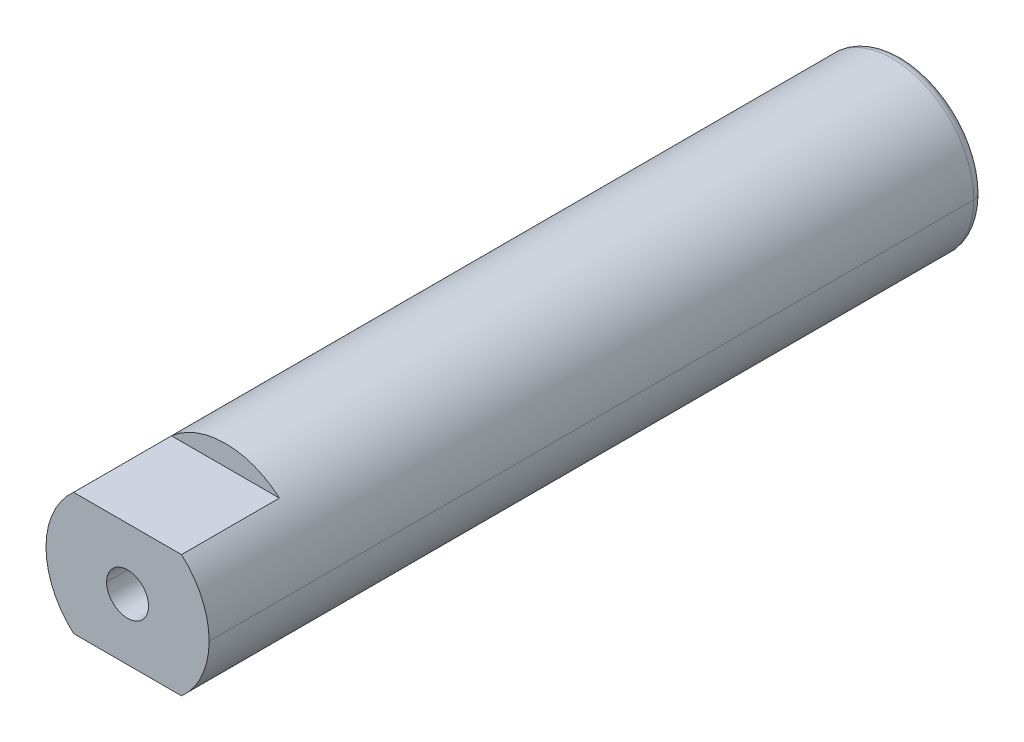
ISO-10303-21;
HEADER;
FILE_DESCRIPTION(('STEP AP214'),'2;1');
FILE_NAME('part.step','',(''),(''),'','','');
FILE_SCHEMA(('AUTOMOTIVE_DESIGN { 1 0 10303 214 1 1 1 1 }'));
ENDSEC;
DATA;
#1=APPLICATION_CONTEXT('core data for automotive mechanical design processes');
#2=APPLICATION_PROTOCOL_DEFINITION('international standard','automotive_design',2000,#1);
#3=PRODUCT_CONTEXT('',#1,'mechanical');
#4=PRODUCT('Part','Part','',(#3));
#5=PRODUCT_RELATED_PRODUCT_CATEGORY('part','',(#4));
#6=PRODUCT_DEFINITION_FORMATION('','',#4);
#7=PRODUCT_DEFINITION_CONTEXT('part definition',#1,'design');
#8=PRODUCT_DEFINITION('design','',#6,#7);
#9=PRODUCT_DEFINITION_SHAPE('','',#8);
#10=(LENGTH_UNIT() NAMED_UNIT(*) SI_UNIT(.MILLI.,.METRE.));
#11=(NAMED_UNIT(*) PLANE_ANGLE_UNIT() SI_UNIT($,.RADIAN.));
#12=(NAMED_UNIT(*) SI_UNIT($,.STERADIAN.) SOLID_ANGLE_UNIT());
#13=UNCERTAINTY_MEASURE_WITH_UNIT(LENGTH_MEASURE(1.E-05),#10,'distance_accuracy_value','');
#14=(GEOMETRIC_REPRESENTATION_CONTEXT(3) GLOBAL_UNCERTAINTY_ASSIGNED_CONTEXT((#13)) GLOBAL_UNIT_ASSIGNED_CONTEXT((#10,
#11,#12)) REPRESENTATION_CONTEXT('',''));
#15=CARTESIAN_POINT('',(0.,0.,0.));
#16=DIRECTION('',(0.,0.,1.));
#17=DIRECTION('',(1.,0.,0.));
#18=AXIS2_PLACEMENT_3D('',#15,#16,#17);
#19=CARTESIAN_POINT('',(-12.7,9.525,60.325));
#20=DIRECTION('',(0.,-1.,0.));
#21=DIRECTION('',(0.,0.,-1.));
#22=AXIS2_PLACEMENT_3D('',#19,#20,#21);
#23=PLANE('',#22);
#24=DIRECTION('',(1.,0.,0.));
#25=VECTOR('',#24,1.);
#26=CARTESIAN_POINT('',(0.,9.525,60.325));
#27=LINE('',#26,#25);
#28=CARTESIAN_POINT('',(-8.40026041263007,9.525,60.325));
#29=VERTEX_POINT('',#28);
#30=CARTESIAN_POINT('',(8.40026041263007,9.525,60.325));
#31=VERTEX_POINT('',#30);
#32=EDGE_CURVE('E168',#29,#31,#27,.T.);
#33=ORIENTED_EDGE('',*,*,#32,.T.);
#34=DIRECTION('',(0.,0.,1.));
#35=VECTOR('',#34,1.);
#36=CARTESIAN_POINT('',(8.40026041263007,9.525,60.325));
#37=LINE('',#36,#35);
#38=CARTESIAN_POINT('',(8.40026041263007,9.525,45.085));
#39=VERTEX_POINT('',#38);
#40=EDGE_CURVE('E163',#39,#31,#37,.T.);
#41=ORIENTED_EDGE('',*,*,#40,.F.);
#42=DIRECTION('',(1.,0.,0.));
#43=VECTOR('',#42,1.);
#44=CARTESIAN_POINT('',(-12.7,9.525,45.085));
#45=LINE('',#44,#43);
#46=CARTESIAN_POINT('',(-8.40026041263007,9.525,45.085));
#47=VERTEX_POINT('',#46);
#48=EDGE_CURVE('E11',#47,#39,#45,.T.);
#49=ORIENTED_EDGE('',*,*,#48,.F.);
#50=DIRECTION('',(0.,0.,-1.));
#51=VECTOR('',#50,1.);
#52=CARTESIAN_POINT('',(-8.40026041263007,9.525,60.325));
#53=LINE('',#52,#51);
#54=EDGE_CURVE('E181',#29,#47,#53,.T.);
#55=ORIENTED_EDGE('',*,*,#54,.F.);
#56=EDGE_LOOP('',(#33,#41,#49,#55));
#57=FACE_BOUND('',#56,.T.);
#58=ADVANCED_FACE('F17',(#57),#23,.F.);
#59=CARTESIAN_POINT('',(-12.7,12.7,45.085));
#60=DIRECTION('',(0.,0.,-1.));
#61=DIRECTION('',(0.,-1.,0.));
#62=AXIS2_PLACEMENT_3D('',#59,#60,#61);
#63=PLANE('',#62);
#64=ORIENTED_EDGE('',*,*,#48,.T.);
#65=CARTESIAN_POINT('',(0.,0.,45.085));
#66=DIRECTION('',(0.,0.,-1.));
#67=DIRECTION('',(-1.,0.,0.));
#68=AXIS2_PLACEMENT_3D('',#65,#66,#67);
#69=CIRCLE('',#68,12.7);
#70=EDGE_CURVE('E174',#47,#39,#69,.T.);
#71=ORIENTED_EDGE('',*,*,#70,.F.);
#72=EDGE_LOOP('',(#64,#71));
#73=FACE_BOUND('',#72,.T.);
#74=ADVANCED_FACE('F19',(#73),#63,.F.);
#75=CARTESIAN_POINT('',(-12.7,-9.525,60.325));
#76=DIRECTION('',(0.,1.,0.));
#77=DIRECTION('',(1.,0.,0.));
#78=AXIS2_PLACEMENT_3D('',#75,#76,#77);
#79=PLANE('',#78);
#80=DIRECTION('',(-1.,0.,0.));
#81=VECTOR('',#80,1.);
#82=CARTESIAN_POINT('',(0.,-9.525,60.325));
#83=LINE('',#82,#81);
#84=CARTESIAN_POINT('',(8.40026041263007,-9.525,60.325));
#85=VERTEX_POINT('',#84);
#86=CARTESIAN_POINT('',(-8.40026041263007,-9.525,60.325));
#87=VERTEX_POINT('',#86);
#88=EDGE_CURVE('E43',#85,#87,#83,.T.);
#89=ORIENTED_EDGE('',*,*,#88,.T.);
#90=DIRECTION('',(0.,0.,1.));
#91=VECTOR('',#90,1.);
#92=CARTESIAN_POINT('',(-8.40026041263007,-9.525,60.325));
#93=LINE('',#92,#91);
#94=CARTESIAN_POINT('',(-8.40026041263007,-9.525,45.085));
#95=VERTEX_POINT('',#94);
#96=EDGE_CURVE('E145',#95,#87,#93,.T.);
#97=ORIENTED_EDGE('',*,*,#96,.F.);
#98=DIRECTION('',(1.,0.,0.));
#99=VECTOR('',#98,1.);
#100=CARTESIAN_POINT('',(-12.7,-9.525,45.085));
#101=LINE('',#100,#99);
#102=CARTESIAN_POINT('',(8.40026041263007,-9.525,45.085));
#103=VERTEX_POINT('',#102);
#104=EDGE_CURVE('E28',#95,#103,#101,.T.);
#105=ORIENTED_EDGE('',*,*,#104,.T.);
#106=DIRECTION('',(0.,0.,-1.));
#107=VECTOR('',#106,1.);
#108=CARTESIAN_POINT('',(8.40026041263007,-9.525,60.325));
#109=LINE('',#108,#107);
#110=EDGE_CURVE('E146',#85,#103,#109,.T.);
#111=ORIENTED_EDGE('',*,*,#110,.F.);
#112=EDGE_LOOP('',(#89,#97,#105,#111));
#113=FACE_BOUND('',#112,.T.);
#114=ADVANCED_FACE('F264',(#113),#79,.F.);
#115=CARTESIAN_POINT('',(-12.7,-12.7,45.085));
#116=DIRECTION('',(0.,0.,-1.));
#117=DIRECTION('',(-1.,0.,0.));
#118=AXIS2_PLACEMENT_3D('',#115,#116,#117);
#119=PLANE('',#118);
#120=ORIENTED_EDGE('',*,*,#104,.F.);
#121=CARTESIAN_POINT('',(0.,0.,45.085));
#122=DIRECTION('',(0.,0.,-1.));
#123=DIRECTION('',(0.,1.,0.));
#124=AXIS2_PLACEMENT_3D('',#121,#122,#123);
#125=CIRCLE('',#124,12.7);
#126=EDGE_CURVE('E142',#103,#95,#125,.T.);
#127=ORIENTED_EDGE('',*,*,#126,.F.);
#128=EDGE_LOOP('',(#120,#127));
#129=FACE_BOUND('',#128,.T.);
#130=ADVANCED_FACE('F279',(#129),#119,.F.);
#131=CARTESIAN_POINT('',(0.,0.,60.325));
#132=DIRECTION('',(0.,0.,1.));
#133=DIRECTION('',(1.,0.,0.));
#134=AXIS2_PLACEMENT_3D('',#131,#132,#133);
#135=CYLINDRICAL_SURFACE('',#134,3.2639);
#136=DIRECTION('',(0.,0.,1.));
#137=VECTOR('',#136,1.);
#138=CARTESIAN_POINT('',(-3.2639,0.,60.325));
#139=LINE('',#138,#137);
#140=CARTESIAN_POINT('',(-3.2639,0.,31.115));
#141=VERTEX_POINT('',#140);
#142=CARTESIAN_POINT('',(-3.2639,0.,60.325));
#143=VERTEX_POINT('',#142);
#144=EDGE_CURVE('E175',#141,#143,#139,.T.);
#145=ORIENTED_EDGE('',*,*,#144,.F.);
#146=CARTESIAN_POINT('',(0.,0.,31.115));
#147=DIRECTION('',(0.,0.,1.));
#148=DIRECTION('',(1.,0.,0.));
#149=AXIS2_PLACEMENT_3D('',#146,#147,#148);
#150=CIRCLE('',#149,3.2639);
#151=CARTESIAN_POINT('',(3.2639,0.,31.115));
#152=VERTEX_POINT('',#151);
#153=EDGE_CURVE('E112',#152,#141,#150,.T.);
#154=ORIENTED_EDGE('',*,*,#153,.F.);
#155=DIRECTION('',(0.,0.,1.));
#156=VECTOR('',#155,1.);
#157=CARTESIAN_POINT('',(3.2639,0.,60.325));
#158=LINE('',#157,#156);
#159=CARTESIAN_POINT('',(3.2639,0.,60.325));
#160=VERTEX_POINT('',#159);
#161=EDGE_CURVE('E191',#152,#160,#158,.T.);
#162=ORIENTED_EDGE('',*,*,#161,.T.);
#163=CARTESIAN_POINT('',(0.,0.,60.325));
#164=DIRECTION('',(0.,0.,1.));
#165=DIRECTION('',(1.,0.,0.));
#166=AXIS2_PLACEMENT_3D('',#163,#164,#165);
#167=CIRCLE('',#166,3.2639);
#168=EDGE_CURVE('E113',#160,#143,#167,.T.);
#169=ORIENTED_EDGE('',*,*,#168,.T.);
#170=EDGE_LOOP('',(#145,#154,#162,#169));
#171=FACE_BOUND('',#170,.T.);
#172=ADVANCED_FACE('F226',(#171),#135,.F.);
#173=CARTESIAN_POINT('',(0.,0.,31.115));
#174=DIRECTION('',(0.,0.,1.));
#175=DIRECTION('',(1.,0.,0.));
#176=AXIS2_PLACEMENT_3D('',#173,#174,#175);
#177=CONICAL_SURFACE('',#176,3.2639,1.02974425867665);
#178=DIRECTION('',(-0.857167300702111,0.,0.515038074910056));
#179=VECTOR('',#178,1.);
#180=CARTESIAN_POINT('',(-3.2639,0.,31.115));
#181=LINE('',#180,#179);
#182=CARTESIAN_POINT('',(0.,0.,29.153851025556));
#183=VERTEX_POINT('',#182);
#184=EDGE_CURVE('E129',#183,#141,#181,.T.);
#185=ORIENTED_EDGE('',*,*,#184,.F.);
#186=DIRECTION('',(0.857167300702111,0.,0.515038074910056));
#187=VECTOR('',#186,1.);
#188=CARTESIAN_POINT('',(3.2639,0.,31.115));
#189=LINE('',#188,#187);
#190=EDGE_CURVE('E136',#183,#152,#189,.T.);
#191=ORIENTED_EDGE('',*,*,#190,.T.);
#192=ORIENTED_EDGE('',*,*,#153,.T.);
#193=EDGE_LOOP('',(#185,#191,#192));
#194=FACE_BOUND('',#193,.T.);
#195=ADVANCED_FACE('F278',(#194),#177,.F.);
#196=CARTESIAN_POINT('',(0.,0.,-58.7375));
#197=DIRECTION('',(0.,0.,1.));
#198=DIRECTION('',(1.,0.,0.));
#199=AXIS2_PLACEMENT_3D('',#196,#197,#198);
#200=TOROIDAL_SURFACE('',#199,11.1125,1.5875);
#201=CARTESIAN_POINT('',(-11.1125,0.,-58.7375));
#202=DIRECTION('',(0.,1.,0.));
#203=DIRECTION('',(-1.,0.,0.));
#204=AXIS2_PLACEMENT_3D('',#201,#202,#203);
#205=CIRCLE('',#204,1.5875);
#206=CARTESIAN_POINT('',(-11.1125,0.,-60.325));
#207=VERTEX_POINT('',#206);
#208=CARTESIAN_POINT('',(-12.7,0.,-58.7375));
#209=VERTEX_POINT('',#208);
#210=EDGE_CURVE('E116',#207,#209,#205,.T.);
#211=ORIENTED_EDGE('',*,*,#210,.F.);
#212=CARTESIAN_POINT('',(0.,0.,-60.325));
#213=DIRECTION('',(0.,0.,-1.));
#214=DIRECTION('',(1.,0.,0.));
#215=AXIS2_PLACEMENT_3D('',#212,#213,#214);
#216=CIRCLE('',#215,11.1125);
#217=CARTESIAN_POINT('',(11.1125,0.,-60.325));
#218=VERTEX_POINT('',#217);
#219=EDGE_CURVE('E103',#218,#207,#216,.T.);
#220=ORIENTED_EDGE('',*,*,#219,.F.);
#221=CARTESIAN_POINT('',(11.1125,0.,-58.7375));
#222=DIRECTION('',(0.,-1.,0.));
#223=DIRECTION('',(0.,0.,-1.));
#224=AXIS2_PLACEMENT_3D('',#221,#222,#223);
#225=CIRCLE('',#224,1.5875);
#226=CARTESIAN_POINT('',(12.7,0.,-58.7375));
#227=VERTEX_POINT('',#226);
#228=EDGE_CURVE('E127',#218,#227,#225,.T.);
#229=ORIENTED_EDGE('',*,*,#228,.T.);
#230=CARTESIAN_POINT('',(0.,0.,-58.7375));
#231=DIRECTION('',(0.,0.,1.));
#232=DIRECTION('',(1.,0.,0.));
#233=AXIS2_PLACEMENT_3D('',#230,#231,#232);
#234=CIRCLE('',#233,12.7);
#235=EDGE_CURVE('E119',#209,#227,#234,.T.);
#236=ORIENTED_EDGE('',*,*,#235,.F.);
#237=EDGE_LOOP('',(#211,#220,#229,#236));
#238=FACE_BOUND('',#237,.T.);
#239=ADVANCED_FACE('F117',(#238),#200,.T.);
#240=CARTESIAN_POINT('',(0.,0.,-60.325));
#241=DIRECTION('',(0.,0.,1.));
#242=DIRECTION('',(1.,0.,0.));
#243=AXIS2_PLACEMENT_3D('',#240,#241,#242);
#244=PLANE('',#243);
#245=ORIENTED_EDGE('',*,*,#219,.T.);
#246=CARTESIAN_POINT('',(0.,0.,-60.325));
#247=DIRECTION('',(0.,0.,-1.));
#248=DIRECTION('',(1.,0.,0.));
#249=AXIS2_PLACEMENT_3D('',#246,#247,#248);
#250=CIRCLE('',#249,11.1125);
#251=EDGE_CURVE('E107',#207,#218,#250,.T.);
#252=ORIENTED_EDGE('',*,*,#251,.T.);
#253=EDGE_LOOP('',(#245,#252));
#254=FACE_BOUND('',#253,.T.);
#255=ADVANCED_FACE('F105',(#254),#244,.F.);
#256=CARTESIAN_POINT('',(0.,0.,60.325));
#257=DIRECTION('',(0.,0.,1.));
#258=DIRECTION('',(1.,0.,0.));
#259=AXIS2_PLACEMENT_3D('',#256,#257,#258);
#260=PLANE('',#259);
#261=ORIENTED_EDGE('',*,*,#168,.F.);
#262=CARTESIAN_POINT('',(0.,0.,60.325));
#263=DIRECTION('',(0.,0.,1.));
#264=DIRECTION('',(1.,0.,0.));
#265=AXIS2_PLACEMENT_3D('',#262,#263,#264);
#266=CIRCLE('',#265,3.2639);
#267=EDGE_CURVE('E179',#143,#160,#266,.T.);
#268=ORIENTED_EDGE('',*,*,#267,.F.);
#269=EDGE_LOOP('',(#261,#268));
#270=FACE_BOUND('',#269,.T.);
#271=ORIENTED_EDGE('',*,*,#32,.F.);
#272=CARTESIAN_POINT('',(0.,0.,60.325));
#273=DIRECTION('',(0.,0.,1.));
#274=DIRECTION('',(1.,0.,0.));
#275=AXIS2_PLACEMENT_3D('',#272,#273,#274);
#276=CIRCLE('',#275,12.7);
#277=CARTESIAN_POINT('',(-12.7,0.,60.325));
#278=VERTEX_POINT('',#277);
#279=EDGE_CURVE('E185',#29,#278,#276,.T.);
#280=ORIENTED_EDGE('',*,*,#279,.T.);
#281=CARTESIAN_POINT('',(0.,0.,60.325));
#282=DIRECTION('',(0.,0.,1.));
#283=DIRECTION('',(1.,0.,0.));
#284=AXIS2_PLACEMENT_3D('',#281,#282,#283);
#285=CIRCLE('',#284,12.7);
#286=EDGE_CURVE('E155',#278,#87,#285,.T.);
#287=ORIENTED_EDGE('',*,*,#286,.T.);
#288=ORIENTED_EDGE('',*,*,#88,.F.);
#289=CARTESIAN_POINT('',(0.,0.,60.325));
#290=DIRECTION('',(0.,0.,1.));
#291=DIRECTION('',(1.,0.,0.));
#292=AXIS2_PLACEMENT_3D('',#289,#290,#291);
#293=CIRCLE('',#292,12.7);
#294=CARTESIAN_POINT('',(12.7,0.,60.325));
#295=VERTEX_POINT('',#294);
#296=EDGE_CURVE('E157',#85,#295,#293,.T.);
#297=ORIENTED_EDGE('',*,*,#296,.T.);
#298=CARTESIAN_POINT('',(0.,0.,60.325));
#299=DIRECTION('',(0.,0.,1.));
#300=DIRECTION('',(1.,0.,0.));
#301=AXIS2_PLACEMENT_3D('',#298,#299,#300);
#302=CIRCLE('',#301,12.7);
#303=EDGE_CURVE('E21',#295,#31,#302,.T.);
#304=ORIENTED_EDGE('',*,*,#303,.T.);
#305=EDGE_LOOP('',(#271,#280,#287,#288,#297,#304));
#306=FACE_BOUND('',#305,.T.);
#307=ADVANCED_FACE('F232',(#270,#306),#260,.T.);
#308=CARTESIAN_POINT('',(0.,0.,60.325));
#309=DIRECTION('',(0.,0.,-1.));
#310=DIRECTION('',(-1.,0.,0.));
#311=AXIS2_PLACEMENT_3D('',#308,#309,#310);
#312=CYLINDRICAL_SURFACE('',#311,12.7);
#313=DIRECTION('',(0.,0.,-1.));
#314=VECTOR('',#313,1.);
#315=CARTESIAN_POINT('',(12.7,0.,60.325));
#316=LINE('',#315,#314);
#317=EDGE_CURVE('E209',#295,#227,#316,.T.);
#318=ORIENTED_EDGE('',*,*,#317,.F.);
#319=ORIENTED_EDGE('',*,*,#296,.F.);
#320=ORIENTED_EDGE('',*,*,#110,.T.);
#321=ORIENTED_EDGE('',*,*,#126,.T.);
#322=ORIENTED_EDGE('',*,*,#96,.T.);
#323=ORIENTED_EDGE('',*,*,#286,.F.);
#324=DIRECTION('',(0.,0.,-1.));
#325=VECTOR('',#324,1.);
#326=CARTESIAN_POINT('',(-12.7,0.,60.325));
#327=LINE('',#326,#325);
#328=EDGE_CURVE('E206',#278,#209,#327,.T.);
#329=ORIENTED_EDGE('',*,*,#328,.T.);
#330=ORIENTED_EDGE('',*,*,#235,.T.);
#331=EDGE_LOOP('',(#318,#319,#320,#321,#322,#323,#329,#330));
#332=FACE_BOUND('',#331,.T.);
#333=ADVANCED_FACE('F318',(#332),#312,.T.);
#334=CARTESIAN_POINT('',(0.,0.,60.325));
#335=DIRECTION('',(0.,0.,-1.));
#336=DIRECTION('',(-1.,0.,0.));
#337=AXIS2_PLACEMENT_3D('',#334,#335,#336);
#338=CYLINDRICAL_SURFACE('',#337,12.7);
#339=ORIENTED_EDGE('',*,*,#303,.F.);
#340=ORIENTED_EDGE('',*,*,#317,.T.);
#341=CARTESIAN_POINT('',(0.,0.,-58.7375));
#342=DIRECTION('',(0.,0.,1.));
#343=DIRECTION('',(1.,0.,0.));
#344=AXIS2_PLACEMENT_3D('',#341,#342,#343);
#345=CIRCLE('',#344,12.7);
#346=EDGE_CURVE('E124',#227,#209,#345,.T.);
#347=ORIENTED_EDGE('',*,*,#346,.T.);
#348=ORIENTED_EDGE('',*,*,#328,.F.);
#349=ORIENTED_EDGE('',*,*,#279,.F.);
#350=ORIENTED_EDGE('',*,*,#54,.T.);
#351=ORIENTED_EDGE('',*,*,#70,.T.);
#352=ORIENTED_EDGE('',*,*,#40,.T.);
#353=EDGE_LOOP('',(#339,#340,#347,#348,#349,#350,#351,#352));
#354=FACE_BOUND('',#353,.T.);
#355=ADVANCED_FACE('F313',(#354),#338,.T.);
#356=CARTESIAN_POINT('',(0.,0.,-58.7375));
#357=DIRECTION('',(0.,0.,1.));
#358=DIRECTION('',(1.,0.,0.));
#359=AXIS2_PLACEMENT_3D('',#356,#357,#358);
#360=TOROIDAL_SURFACE('',#359,11.1125,1.5875);
#361=ORIENTED_EDGE('',*,*,#251,.F.);
#362=ORIENTED_EDGE('',*,*,#210,.T.);
#363=ORIENTED_EDGE('',*,*,#346,.F.);
#364=ORIENTED_EDGE('',*,*,#228,.F.);
#365=EDGE_LOOP('',(#361,#362,#363,#364));
#366=FACE_BOUND('',#365,.T.);
#367=ADVANCED_FACE('F126',(#366),#360,.T.);
#368=CARTESIAN_POINT('',(0.,0.,31.115));
#369=DIRECTION('',(0.,0.,1.));
#370=DIRECTION('',(1.,0.,0.));
#371=AXIS2_PLACEMENT_3D('',#368,#369,#370);
#372=CONICAL_SURFACE('',#371,3.2639,1.02974425867665);
#373=ORIENTED_EDGE('',*,*,#190,.F.);
#374=ORIENTED_EDGE('',*,*,#184,.T.);
#375=CARTESIAN_POINT('',(0.,0.,31.115));
#376=DIRECTION('',(0.,0.,1.));
#377=DIRECTION('',(1.,0.,0.));
#378=AXIS2_PLACEMENT_3D('',#375,#376,#377);
#379=CIRCLE('',#378,3.2639);
#380=EDGE_CURVE('E180',#141,#152,#379,.T.);
#381=ORIENTED_EDGE('',*,*,#380,.T.);
#382=EDGE_LOOP('',(#373,#374,#381));
#383=FACE_BOUND('',#382,.T.);
#384=ADVANCED_FACE('F299',(#383),#372,.F.);
#385=CARTESIAN_POINT('',(0.,0.,60.325));
#386=DIRECTION('',(0.,0.,1.));
#387=DIRECTION('',(1.,0.,0.));
#388=AXIS2_PLACEMENT_3D('',#385,#386,#387);
#389=CYLINDRICAL_SURFACE('',#388,3.2639);
#390=ORIENTED_EDGE('',*,*,#380,.F.);
#391=ORIENTED_EDGE('',*,*,#144,.T.);
#392=ORIENTED_EDGE('',*,*,#267,.T.);
#393=ORIENTED_EDGE('',*,*,#161,.F.);
#394=EDGE_LOOP('',(#390,#391,#392,#393));
#395=FACE_BOUND('',#394,.T.);
#396=ADVANCED_FACE('F230',(#395),#389,.F.);
#397=CLOSED_SHELL('',(#58,#74,#114,#130,#172,#195,#239,#255,#307,#333,#355,#367,#384,#396));
#398=MANIFOLD_SOLID_BREP('B1',#397);
#399=ADVANCED_BREP_SHAPE_REPRESENTATION('',(#18,#398),#14);
#400=SHAPE_DEFINITION_REPRESENTATION(#9,#399);
ENDSEC;
END-ISO-10303-21;
